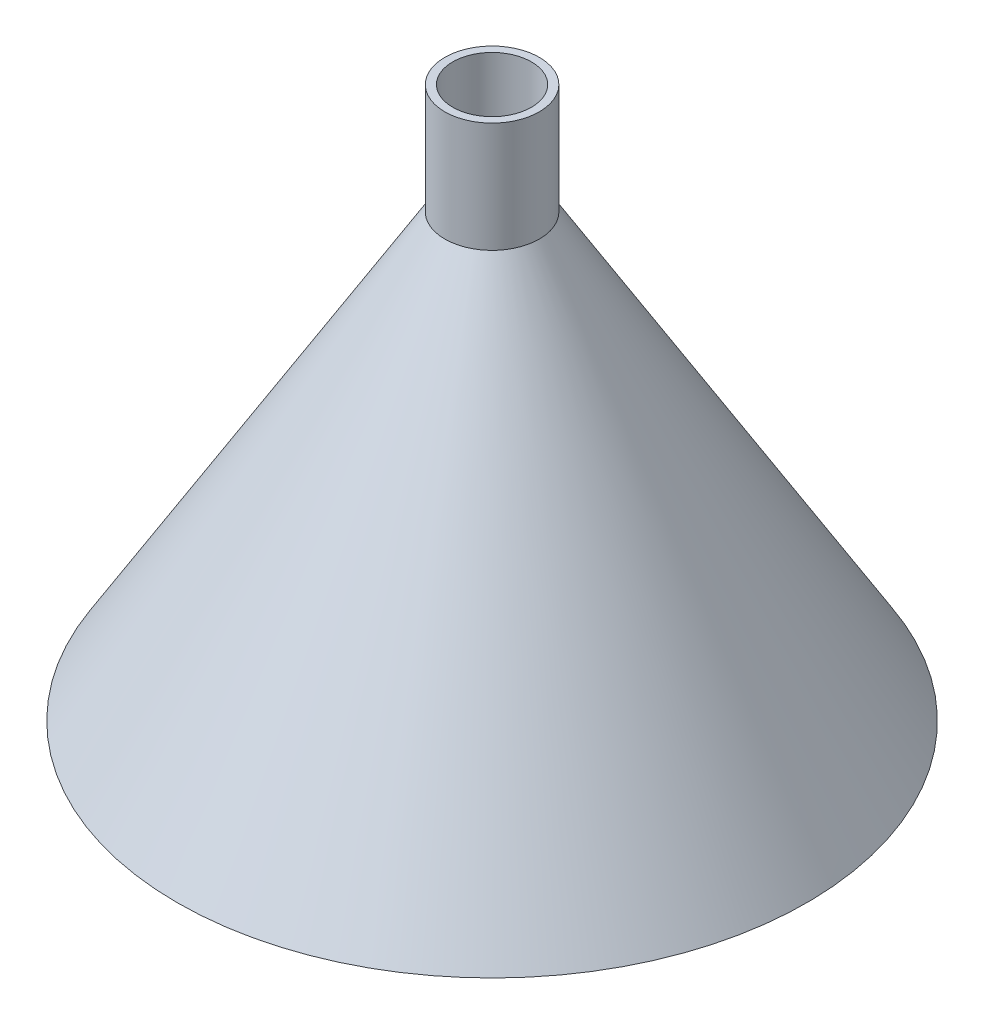
ISO-10303-21;
HEADER;
FILE_DESCRIPTION(('STEP AP214'),'2;1');
FILE_NAME('part.step','',(''),(''),'','','');
FILE_SCHEMA(('AUTOMOTIVE_DESIGN { 1 0 10303 214 1 1 1 1 }'));
ENDSEC;
DATA;
#1=APPLICATION_CONTEXT('core data for automotive mechanical design processes');
#2=APPLICATION_PROTOCOL_DEFINITION('international standard','automotive_design',2000,#1);
#3=PRODUCT_CONTEXT('',#1,'mechanical');
#4=PRODUCT('Part','Part','',(#3));
#5=PRODUCT_RELATED_PRODUCT_CATEGORY('part','',(#4));
#6=PRODUCT_DEFINITION_FORMATION('','',#4);
#7=PRODUCT_DEFINITION_CONTEXT('part definition',#1,'design');
#8=PRODUCT_DEFINITION('design','',#6,#7);
#9=PRODUCT_DEFINITION_SHAPE('','',#8);
#10=(LENGTH_UNIT() NAMED_UNIT(*) SI_UNIT(.MILLI.,.METRE.));
#11=(NAMED_UNIT(*) PLANE_ANGLE_UNIT() SI_UNIT($,.RADIAN.));
#12=(NAMED_UNIT(*) SI_UNIT($,.STERADIAN.) SOLID_ANGLE_UNIT());
#13=UNCERTAINTY_MEASURE_WITH_UNIT(LENGTH_MEASURE(1.E-05),#10,'distance_accuracy_value','');
#14=(GEOMETRIC_REPRESENTATION_CONTEXT(3) GLOBAL_UNCERTAINTY_ASSIGNED_CONTEXT((#13)) GLOBAL_UNIT_ASSIGNED_CONTEXT((#10,
#11,#12)) REPRESENTATION_CONTEXT('',''));
#15=CARTESIAN_POINT('',(0.,0.,0.));
#16=DIRECTION('',(0.,0.,1.));
#17=DIRECTION('',(1.,0.,0.));
#18=AXIS2_PLACEMENT_3D('',#15,#16,#17);
#19=CARTESIAN_POINT('',(0.,140.,0.));
#20=DIRECTION('',(0.,1.,0.));
#21=DIRECTION('',(0.,0.,1.));
#22=AXIS2_PLACEMENT_3D('',#19,#20,#21);
#23=PLANE('',#22);
#24=CARTESIAN_POINT('',(0.,140.,0.));
#25=DIRECTION('',(0.,-1.,0.));
#26=DIRECTION('',(0.,0.,-1.));
#27=AXIS2_PLACEMENT_3D('',#24,#25,#26);
#28=CIRCLE('',#27,12.3786657727831);
#29=CARTESIAN_POINT('',(0.,140.,-12.378665772783));
#30=VERTEX_POINT('',#29);
#31=EDGE_CURVE('E56',#30,#30,#28,.T.);
#32=ORIENTED_EDGE('',*,*,#31,.T.);
#33=EDGE_LOOP('',(#32));
#34=FACE_BOUND('',#33,.T.);
#35=CARTESIAN_POINT('',(0.,140.,0.));
#36=DIRECTION('',(0.,1.,0.));
#37=DIRECTION('',(1.,0.,0.));
#38=AXIS2_PLACEMENT_3D('',#35,#36,#37);
#39=CIRCLE('',#38,12.5);
#40=CARTESIAN_POINT('',(12.5,140.,0.));
#41=VERTEX_POINT('',#40);
#42=EDGE_CURVE('E76',#41,#41,#39,.T.);
#43=ORIENTED_EDGE('',*,*,#42,.T.);
#44=EDGE_LOOP('',(#43));
#45=FACE_BOUND('',#44,.T.);
#46=ADVANCED_FACE('F43',(#34,#45),#23,.T.);
#47=CARTESIAN_POINT('',(0.,0.,0.));
#48=DIRECTION('',(0.,-1.,0.));
#49=DIRECTION('',(0.,0.,1.));
#50=AXIS2_PLACEMENT_3D('',#47,#48,#49);
#51=CONICAL_SURFACE('',#50,100.,0.546288055874226);
#52=CARTESIAN_POINT('',(0.,140.,0.));
#53=DIRECTION('',(0.,1.,0.));
#54=DIRECTION('',(0.,0.,1.));
#55=AXIS2_PLACEMENT_3D('',#52,#53,#54);
#56=CIRCLE('',#55,14.878665772783);
#57=CARTESIAN_POINT('',(0.,140.,14.878665772783));
#58=VERTEX_POINT('',#57);
#59=EDGE_CURVE('E11',#58,#58,#56,.T.);
#60=CARTESIAN_POINT('',(0.,0.,0.));
#61=DIRECTION('',(0.,1.,0.));
#62=DIRECTION('',(0.,0.,1.));
#63=AXIS2_PLACEMENT_3D('',#60,#61,#62);
#64=CIRCLE('',#63,100.);
#65=CARTESIAN_POINT('',(0.,0.,100.));
#66=VERTEX_POINT('',#65);
#67=EDGE_CURVE('E51',#66,#66,#64,.T.);
#68=CARTESIAN_POINT('',(0.,140.,14.878665772783));
#69=CARTESIAN_POINT('',(0.,138.541666666667,15.7653463376499));
#70=CARTESIAN_POINT('',(0.,137.083333333333,16.6520269025167));
#71=CARTESIAN_POINT('',(0.,134.166666666667,18.4253880322504));
#72=CARTESIAN_POINT('',(0.,132.708333333333,19.3120685971172));
#73=CARTESIAN_POINT('',(0.,129.791666666667,21.0854297268509));
#74=CARTESIAN_POINT('',(0.,128.333333333333,21.9721102917178));
#75=CARTESIAN_POINT('',(0.,125.416666666667,23.7454714214515));
#76=CARTESIAN_POINT('',(0.,123.958333333333,24.6321519863183));
#77=CARTESIAN_POINT('',(0.,121.041666666667,26.405513116052));
#78=CARTESIAN_POINT('',(0.,119.583333333333,27.2921936809188));
#79=CARTESIAN_POINT('',(0.,116.666666666667,29.0655548106525));
#80=CARTESIAN_POINT('',(0.,115.208333333333,29.9522353755194));
#81=CARTESIAN_POINT('',(0.,112.291666666667,31.7255965052531));
#82=CARTESIAN_POINT('',(0.,110.833333333333,32.6122770701199));
#83=CARTESIAN_POINT('',(0.,107.916666666667,34.3856381998536));
#84=CARTESIAN_POINT('',(0.,106.458333333333,35.2723187647204));
#85=CARTESIAN_POINT('',(0.,103.541666666667,37.0456798944541));
#86=CARTESIAN_POINT('',(0.,102.083333333333,37.932360459321));
#87=CARTESIAN_POINT('',(0.,99.1666666666667,39.7057215890546));
#88=CARTESIAN_POINT('',(0.,97.7083333333333,40.5924021539215));
#89=CARTESIAN_POINT('',(0.,94.7916666666667,42.3657632836552));
#90=CARTESIAN_POINT('',(0.,93.3333333333333,43.252443848522));
#91=CARTESIAN_POINT('',(0.,90.4166666666667,45.0258049782557));
#92=CARTESIAN_POINT('',(0.,88.9583333333333,45.9124855431225));
#93=CARTESIAN_POINT('',(0.,86.0416666666667,47.6858466728562));
#94=CARTESIAN_POINT('',(0.,84.5833333333333,48.5725272377231));
#95=CARTESIAN_POINT('',(0.,81.6666666666667,50.3458883674568));
#96=CARTESIAN_POINT('',(0.,80.2083333333333,51.2325689323236));
#97=CARTESIAN_POINT('',(0.,77.2916666666667,53.0059300620573));
#98=CARTESIAN_POINT('',(0.,75.8333333333333,53.8926106269241));
#99=CARTESIAN_POINT('',(0.,72.9166666666667,55.6659717566578));
#100=CARTESIAN_POINT('',(0.,71.4583333333333,56.5526523215247));
#101=CARTESIAN_POINT('',(0.,68.5416666666667,58.3260134512584));
#102=CARTESIAN_POINT('',(0.,67.0833333333333,59.2126940161252));
#103=CARTESIAN_POINT('',(0.,64.1666666666667,60.9860551458589));
#104=CARTESIAN_POINT('',(0.,62.7083333333333,61.8727357107257));
#105=CARTESIAN_POINT('',(0.,59.7916666666667,63.6460968404594));
#106=CARTESIAN_POINT('',(0.,58.3333333333333,64.5327774053263));
#107=CARTESIAN_POINT('',(0.,55.4166666666667,66.30613853506));
#108=CARTESIAN_POINT('',(0.,53.9583333333333,67.1928190999268));
#109=CARTESIAN_POINT('',(0.,51.0416666666667,68.9661802296605));
#110=CARTESIAN_POINT('',(0.,49.5833333333333,69.8528607945273));
#111=CARTESIAN_POINT('',(0.,46.6666666666667,71.626221924261));
#112=CARTESIAN_POINT('',(0.,45.2083333333333,72.5129024891278));
#113=CARTESIAN_POINT('',(0.,42.2916666666667,74.2862636188615));
#114=CARTESIAN_POINT('',(0.,40.8333333333333,75.1729441837284));
#115=CARTESIAN_POINT('',(0.,37.9166666666667,76.9463053134621));
#116=CARTESIAN_POINT('',(0.,36.4583333333333,77.8329858783289));
#117=CARTESIAN_POINT('',(0.,33.5416666666667,79.6063470080626));
#118=CARTESIAN_POINT('',(0.,32.0833333333333,80.4930275729294));
#119=CARTESIAN_POINT('',(0.,29.1666666666667,82.2663887026631));
#120=CARTESIAN_POINT('',(0.,27.7083333333333,83.15306926753));
#121=CARTESIAN_POINT('',(0.,24.7916666666667,84.9264303972637));
#122=CARTESIAN_POINT('',(0.,23.3333333333333,85.8131109621305));
#123=CARTESIAN_POINT('',(0.,20.4166666666667,87.5864720918642));
#124=CARTESIAN_POINT('',(0.,18.9583333333333,88.473152656731));
#125=CARTESIAN_POINT('',(0.,16.0416666666667,90.2465137864647));
#126=CARTESIAN_POINT('',(0.,14.5833333333333,91.1331943513316));
#127=CARTESIAN_POINT('',(0.,11.6666666666667,92.9065554810653));
#128=CARTESIAN_POINT('',(0.,10.2083333333333,93.7932360459321));
#129=CARTESIAN_POINT('',(0.,7.29166666666667,95.5665971756658));
#130=CARTESIAN_POINT('',(0.,5.83333333333333,96.4532777405326));
#131=CARTESIAN_POINT('',(0.,2.91666666666666,98.2266388702663));
#132=CARTESIAN_POINT('',(0.,1.45833333333333,99.1133194351332));
#133=CARTESIAN_POINT('',(0.,0.,100.));
#134=B_SPLINE_CURVE_WITH_KNOTS('',3,(#68,#69,#70,#71,#72,#73,#74,#75,#76,#77,#78,#79,#80,#81,
#82,#83,#84,#85,#86,#87,#88,#89,#90,#91,#92,#93,#94,#95,#96,#97,#98,#99,#100,#101,#102,#103,
#104,#105,#106,#107,#108,#109,#110,#111,#112,#113,#114,#115,#116,#117,#118,#119,#120,#121,#122,
#123,#124,#125,#126,#127,#128,#129,#130,#131,#132,#133),.UNSPECIFIED.,.F.,.F.,(4,2,2,2,2,2,2,2,
2,2,2,2,2,2,2,2,2,2,2,2,2,2,2,2,2,2,2,2,2,2,2,2,4),(0.,5.12019988057236,10.2403997611447,
15.3605996417171,20.4807995222895,25.6009994028618,30.7211992834342,35.8413991640066,
40.9615990445789,46.0817989251513,51.2019988057237,56.322198686296,61.4423985668684,
66.5625984474408,71.6827983280131,76.8029982085855,81.9231980891579,87.0433979697302,
92.1635978503026,97.283797730875,102.403997611447,107.52419749202,112.644397372592,
117.764597253164,122.884797133737,128.004997014309,133.125196894881,138.245396775454,
143.365596656026,148.485796536599,153.605996417171,158.726196297743,163.846396178316),.UNSPECIFIED.);
#135=EDGE_CURVE('BSEAM45',#58,#66,#134,.T.);
#136=ORIENTED_EDGE('',*,*,#59,.F.);
#137=ORIENTED_EDGE('',*,*,#67,.T.);
#138=ORIENTED_EDGE('',*,*,#135,.T.);
#139=ORIENTED_EDGE('',*,*,#135,.F.);
#140=EDGE_LOOP('',(#136,#138,#137,#139));
#141=FACE_BOUND('',#140,.T.);
#142=ADVANCED_FACE('F45',(#141),#51,.T.);
#143=CARTESIAN_POINT('',(0.,0.,0.));
#144=DIRECTION('',(0.,1.,0.));
#145=DIRECTION('',(0.,0.,1.));
#146=AXIS2_PLACEMENT_3D('',#143,#144,#145);
#147=PLANE('',#146);
#148=CARTESIAN_POINT('',(0.,0.,0.));
#149=DIRECTION('',(0.,-1.,0.));
#150=DIRECTION('',(0.,0.,-1.));
#151=AXIS2_PLACEMENT_3D('',#148,#149,#150);
#152=CIRCLE('',#151,97.5);
#153=CARTESIAN_POINT('',(0.,0.,-97.5));
#154=VERTEX_POINT('',#153);
#155=EDGE_CURVE('E61',#154,#154,#152,.T.);
#156=ORIENTED_EDGE('',*,*,#155,.F.);
#157=EDGE_LOOP('',(#156));
#158=FACE_BOUND('',#157,.T.);
#159=ORIENTED_EDGE('',*,*,#67,.F.);
#160=EDGE_LOOP('',(#159));
#161=FACE_BOUND('',#160,.T.);
#162=ADVANCED_FACE('F109',(#158,#161),#147,.F.);
#163=CARTESIAN_POINT('',(0.,0.,0.));
#164=DIRECTION('',(0.,-1.,0.));
#165=DIRECTION('',(0.,0.,-1.));
#166=AXIS2_PLACEMENT_3D('',#163,#164,#165);
#167=CONICAL_SURFACE('',#166,97.5,0.546288055874226);
#168=CARTESIAN_POINT('',(0.,140.,-12.378665772783));
#169=CARTESIAN_POINT('',(0.,138.541666666667,-13.2653463376499));
#170=CARTESIAN_POINT('',(0.,137.083333333333,-14.1520269025167));
#171=CARTESIAN_POINT('',(0.,134.166666666667,-15.9253880322504));
#172=CARTESIAN_POINT('',(0.,132.708333333333,-16.8120685971173));
#173=CARTESIAN_POINT('',(0.,129.791666666667,-18.585429726851));
#174=CARTESIAN_POINT('',(0.,128.333333333333,-19.4721102917178));
#175=CARTESIAN_POINT('',(0.,125.416666666667,-21.2454714214515));
#176=CARTESIAN_POINT('',(0.,123.958333333333,-22.1321519863183));
#177=CARTESIAN_POINT('',(0.,121.041666666667,-23.905513116052));
#178=CARTESIAN_POINT('',(0.,119.583333333333,-24.7921936809189));
#179=CARTESIAN_POINT('',(0.,116.666666666667,-26.5655548106525));
#180=CARTESIAN_POINT('',(0.,115.208333333333,-27.4522353755194));
#181=CARTESIAN_POINT('',(0.,112.291666666667,-29.2255965052531));
#182=CARTESIAN_POINT('',(0.,110.833333333333,-30.1122770701199));
#183=CARTESIAN_POINT('',(0.,107.916666666667,-31.8856381998536));
#184=CARTESIAN_POINT('',(0.,106.458333333333,-32.7723187647205));
#185=CARTESIAN_POINT('',(0.,103.541666666667,-34.5456798944541));
#186=CARTESIAN_POINT('',(0.,102.083333333333,-35.432360459321));
#187=CARTESIAN_POINT('',(0.,99.1666666666667,-37.2057215890547));
#188=CARTESIAN_POINT('',(0.,97.7083333333333,-38.0924021539215));
#189=CARTESIAN_POINT('',(0.,94.7916666666667,-39.8657632836552));
#190=CARTESIAN_POINT('',(0.,93.3333333333333,-40.752443848522));
#191=CARTESIAN_POINT('',(0.,90.4166666666667,-42.5258049782557));
#192=CARTESIAN_POINT('',(0.,88.9583333333333,-43.4124855431226));
#193=CARTESIAN_POINT('',(0.,86.0416666666667,-45.1858466728563));
#194=CARTESIAN_POINT('',(0.,84.5833333333333,-46.0725272377231));
#195=CARTESIAN_POINT('',(0.,81.6666666666667,-47.8458883674568));
#196=CARTESIAN_POINT('',(0.,80.2083333333333,-48.7325689323236));
#197=CARTESIAN_POINT('',(0.,77.2916666666667,-50.5059300620573));
#198=CARTESIAN_POINT('',(0.,75.8333333333333,-51.3926106269242));
#199=CARTESIAN_POINT('',(0.,72.9166666666667,-53.1659717566578));
#200=CARTESIAN_POINT('',(0.,71.4583333333333,-54.0526523215247));
#201=CARTESIAN_POINT('',(0.,68.5416666666667,-55.8260134512584));
#202=CARTESIAN_POINT('',(0.,67.0833333333333,-56.7126940161252));
#203=CARTESIAN_POINT('',(0.,64.1666666666667,-58.4860551458589));
#204=CARTESIAN_POINT('',(0.,62.7083333333333,-59.3727357107258));
#205=CARTESIAN_POINT('',(0.,59.7916666666667,-61.1460968404594));
#206=CARTESIAN_POINT('',(0.,58.3333333333333,-62.0327774053263));
#207=CARTESIAN_POINT('',(0.,55.4166666666667,-63.80613853506));
#208=CARTESIAN_POINT('',(0.,53.9583333333333,-64.6928190999268));
#209=CARTESIAN_POINT('',(0.,51.0416666666667,-66.4661802296605));
#210=CARTESIAN_POINT('',(0.,49.5833333333333,-67.3528607945273));
#211=CARTESIAN_POINT('',(0.,46.6666666666667,-69.126221924261));
#212=CARTESIAN_POINT('',(0.,45.2083333333333,-70.0129024891279));
#213=CARTESIAN_POINT('',(0.,42.2916666666667,-71.7862636188616));
#214=CARTESIAN_POINT('',(0.,40.8333333333333,-72.6729441837284));
#215=CARTESIAN_POINT('',(0.,37.9166666666667,-74.4463053134621));
#216=CARTESIAN_POINT('',(0.,36.4583333333333,-75.3329858783289));
#217=CARTESIAN_POINT('',(0.,33.5416666666667,-77.1063470080626));
#218=CARTESIAN_POINT('',(0.,32.0833333333333,-77.9930275729295));
#219=CARTESIAN_POINT('',(0.,29.1666666666667,-79.7663887026632));
#220=CARTESIAN_POINT('',(0.,27.7083333333333,-80.65306926753));
#221=CARTESIAN_POINT('',(0.,24.7916666666667,-82.4264303972637));
#222=CARTESIAN_POINT('',(0.,23.3333333333333,-83.3131109621305));
#223=CARTESIAN_POINT('',(0.,20.4166666666667,-85.0864720918642));
#224=CARTESIAN_POINT('',(0.,18.9583333333333,-85.9731526567311));
#225=CARTESIAN_POINT('',(0.,16.0416666666667,-87.7465137864647));
#226=CARTESIAN_POINT('',(0.,14.5833333333333,-88.6331943513316));
#227=CARTESIAN_POINT('',(0.,11.6666666666667,-90.4065554810653));
#228=CARTESIAN_POINT('',(0.,10.2083333333333,-91.2932360459321));
#229=CARTESIAN_POINT('',(0.,7.29166666666667,-93.0665971756658));
#230=CARTESIAN_POINT('',(0.,5.83333333333333,-93.9532777405327));
#231=CARTESIAN_POINT('',(0.,2.91666666666666,-95.7266388702663));
#232=CARTESIAN_POINT('',(0.,1.45833333333333,-96.6133194351332));
#233=CARTESIAN_POINT('',(0.,0.,-97.5));
#234=B_SPLINE_CURVE_WITH_KNOTS('',3,(#168,#169,#170,#171,#172,#173,#174,#175,#176,#177,#178,
#179,#180,#181,#182,#183,#184,#185,#186,#187,#188,#189,#190,#191,#192,#193,#194,#195,#196,#197,
#198,#199,#200,#201,#202,#203,#204,#205,#206,#207,#208,#209,#210,#211,#212,#213,#214,#215,#216,
#217,#218,#219,#220,#221,#222,#223,#224,#225,#226,#227,#228,#229,#230,#231,#232,#233),
.UNSPECIFIED.,.F.,.F.,(4,2,2,2,2,2,2,2,2,2,2,2,2,2,2,2,2,2,2,2,2,2,2,2,2,2,2,2,2,2,2,2,4),(0.,
5.12019988057236,10.2403997611447,15.3605996417171,20.4807995222895,25.6009994028618,
30.7211992834342,35.8413991640066,40.9615990445789,46.0817989251513,51.2019988057237,
56.322198686296,61.4423985668684,66.5625984474408,71.6827983280131,76.8029982085855,
81.9231980891579,87.0433979697302,92.1635978503026,97.283797730875,102.403997611447,
107.52419749202,112.644397372592,117.764597253164,122.884797133737,128.004997014309,
133.125196894881,138.245396775454,143.365596656026,148.485796536599,153.605996417171,
158.726196297743,163.846396178316),.UNSPECIFIED.);
#235=EDGE_CURVE('BSEAM99',#30,#154,#234,.T.);
#236=ORIENTED_EDGE('',*,*,#31,.F.);
#237=ORIENTED_EDGE('',*,*,#155,.T.);
#238=ORIENTED_EDGE('',*,*,#235,.T.);
#239=ORIENTED_EDGE('',*,*,#235,.F.);
#240=EDGE_LOOP('',(#236,#238,#237,#239));
#241=FACE_BOUND('',#240,.T.);
#242=ADVANCED_FACE('F99',(#241),#167,.F.);
#243=CARTESIAN_POINT('',(0.,140.,0.));
#244=DIRECTION('',(0.,1.,0.));
#245=DIRECTION('',(0.,0.,1.));
#246=AXIS2_PLACEMENT_3D('',#243,#244,#245);
#247=PLANE('',#246);
#248=CARTESIAN_POINT('',(0.,140.,0.));
#249=DIRECTION('',(0.,1.,0.));
#250=DIRECTION('',(0.,0.,1.));
#251=AXIS2_PLACEMENT_3D('',#248,#249,#250);
#252=CIRCLE('',#251,15.);
#253=CARTESIAN_POINT('',(0.,140.,15.));
#254=VERTEX_POINT('',#253);
#255=EDGE_CURVE('E68',#254,#254,#252,.T.);
#256=ORIENTED_EDGE('',*,*,#255,.F.);
#257=EDGE_LOOP('',(#256));
#258=FACE_BOUND('',#257,.T.);
#259=ORIENTED_EDGE('',*,*,#59,.T.);
#260=EDGE_LOOP('',(#259));
#261=FACE_BOUND('',#260,.T.);
#262=ADVANCED_FACE('F90',(#258,#261),#247,.F.);
#263=CARTESIAN_POINT('',(0.,175.,0.));
#264=DIRECTION('',(0.,1.,0.));
#265=DIRECTION('',(0.,0.,1.));
#266=AXIS2_PLACEMENT_3D('',#263,#264,#265);
#267=PLANE('',#266);
#268=CARTESIAN_POINT('',(0.,175.,0.));
#269=DIRECTION('',(0.,1.,0.));
#270=DIRECTION('',(0.,0.,1.));
#271=AXIS2_PLACEMENT_3D('',#268,#269,#270);
#272=CIRCLE('',#271,15.);
#273=CARTESIAN_POINT('',(0.,175.,15.));
#274=VERTEX_POINT('',#273);
#275=EDGE_CURVE('E67',#274,#274,#272,.T.);
#276=ORIENTED_EDGE('',*,*,#275,.T.);
#277=EDGE_LOOP('',(#276));
#278=FACE_BOUND('',#277,.T.);
#279=CARTESIAN_POINT('',(0.,175.,0.));
#280=DIRECTION('',(0.,1.,0.));
#281=DIRECTION('',(1.,0.,0.));
#282=AXIS2_PLACEMENT_3D('',#279,#280,#281);
#283=CIRCLE('',#282,12.5);
#284=CARTESIAN_POINT('',(12.5,175.,0.));
#285=VERTEX_POINT('',#284);
#286=EDGE_CURVE('E72',#285,#285,#283,.T.);
#287=ORIENTED_EDGE('',*,*,#286,.F.);
#288=EDGE_LOOP('',(#287));
#289=FACE_BOUND('',#288,.T.);
#290=ADVANCED_FACE('F87',(#278,#289),#267,.T.);
#291=CARTESIAN_POINT('',(0.,175.,0.));
#292=DIRECTION('',(0.,-1.,0.));
#293=DIRECTION('',(0.,0.,-1.));
#294=AXIS2_PLACEMENT_3D('',#291,#292,#293);
#295=CYLINDRICAL_SURFACE('',#294,15.);
#296=ORIENTED_EDGE('',*,*,#275,.F.);
#297=EDGE_LOOP('',(#296));
#298=FACE_BOUND('',#297,.T.);
#299=ORIENTED_EDGE('',*,*,#255,.T.);
#300=EDGE_LOOP('',(#299));
#301=FACE_BOUND('',#300,.T.);
#302=ADVANCED_FACE('F89',(#298,#301),#295,.T.);
#303=CARTESIAN_POINT('',(0.,175.,0.));
#304=DIRECTION('',(0.,-1.,0.));
#305=DIRECTION('',(0.,0.,-1.));
#306=AXIS2_PLACEMENT_3D('',#303,#304,#305);
#307=CYLINDRICAL_SURFACE('',#306,12.5);
#308=ORIENTED_EDGE('',*,*,#286,.T.);
#309=EDGE_LOOP('',(#308));
#310=FACE_BOUND('',#309,.T.);
#311=ORIENTED_EDGE('',*,*,#42,.F.);
#312=EDGE_LOOP('',(#311));
#313=FACE_BOUND('',#312,.T.);
#314=ADVANCED_FACE('F84',(#310,#313),#307,.F.);
#315=CLOSED_SHELL('',(#46,#142,#162,#242,#262,#290,#302,#314));
#316=MANIFOLD_SOLID_BREP('B2',#315);
#317=ADVANCED_BREP_SHAPE_REPRESENTATION('',(#18,#316),#14);
#318=SHAPE_DEFINITION_REPRESENTATION(#9,#317);
ENDSEC;
END-ISO-10303-21;
